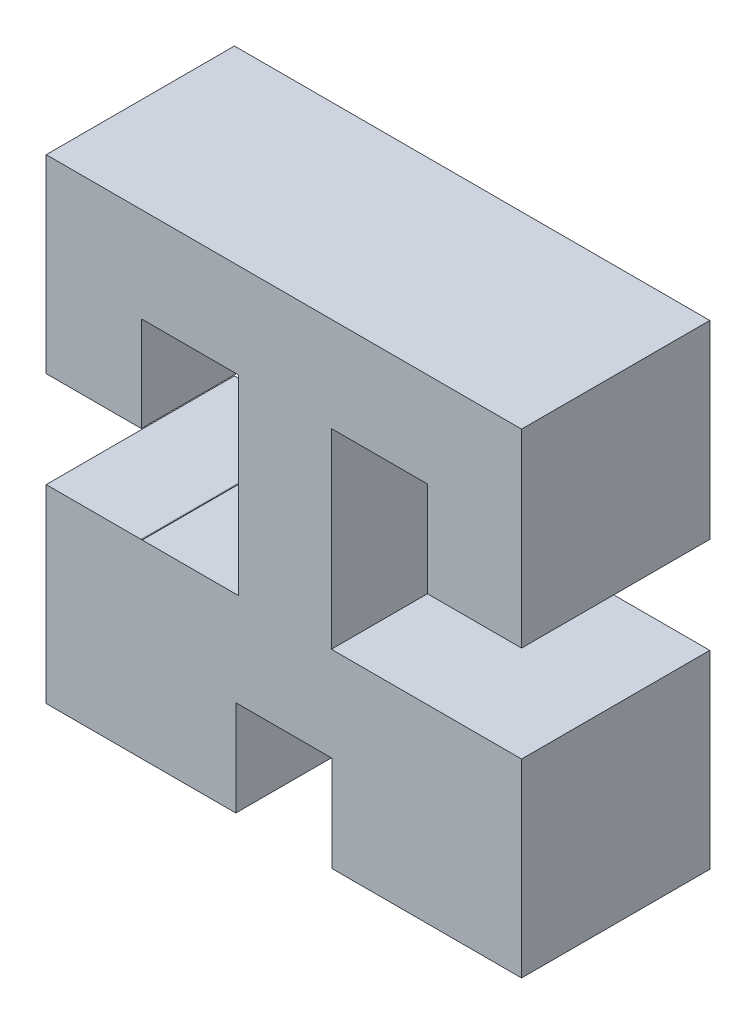
ISO-10303-21;
HEADER;
FILE_DESCRIPTION(('STEP AP214'),'2;1');
FILE_NAME('part.step','',(''),(''),'','','');
FILE_SCHEMA(('AUTOMOTIVE_DESIGN { 1 0 10303 214 1 1 1 1 }'));
ENDSEC;
DATA;
#1=APPLICATION_CONTEXT('core data for automotive mechanical design processes');
#2=APPLICATION_PROTOCOL_DEFINITION('international standard','automotive_design',2000,#1);
#3=PRODUCT_CONTEXT('',#1,'mechanical');
#4=PRODUCT('Part','Part','',(#3));
#5=PRODUCT_RELATED_PRODUCT_CATEGORY('part','',(#4));
#6=PRODUCT_DEFINITION_FORMATION('','',#4);
#7=PRODUCT_DEFINITION_CONTEXT('part definition',#1,'design');
#8=PRODUCT_DEFINITION('design','',#6,#7);
#9=PRODUCT_DEFINITION_SHAPE('','',#8);
#10=(LENGTH_UNIT() NAMED_UNIT(*) SI_UNIT(.MILLI.,.METRE.));
#11=(NAMED_UNIT(*) PLANE_ANGLE_UNIT() SI_UNIT($,.RADIAN.));
#12=(NAMED_UNIT(*) SI_UNIT($,.STERADIAN.) SOLID_ANGLE_UNIT());
#13=UNCERTAINTY_MEASURE_WITH_UNIT(LENGTH_MEASURE(1.E-05),#10,'distance_accuracy_value','');
#14=(GEOMETRIC_REPRESENTATION_CONTEXT(3) GLOBAL_UNCERTAINTY_ASSIGNED_CONTEXT((#13)) GLOBAL_UNIT_ASSIGNED_CONTEXT((#10,
#11,#12)) REPRESENTATION_CONTEXT('',''));
#15=CARTESIAN_POINT('',(0.,0.,0.));
#16=DIRECTION('',(0.,0.,1.));
#17=DIRECTION('',(1.,0.,0.));
#18=AXIS2_PLACEMENT_3D('',#15,#16,#17);
#19=CARTESIAN_POINT('',(-20.076501822496,0.,9.89999994635583));
#20=DIRECTION('',(0.,-1.,0.));
#21=DIRECTION('',(1.,0.,0.));
#22=AXIS2_PLACEMENT_3D('',#19,#20,#21);
#23=PLANE('',#22);
#24=DIRECTION('',(-1.,0.,0.));
#25=VECTOR('',#24,1.);
#26=CARTESIAN_POINT('',(-20.076501822496,0.,0.));
#27=LINE('',#26,#25);
#28=CARTESIAN_POINT('',(-20.076501822496,0.,0.));
#29=VERTEX_POINT('',#28);
#30=CARTESIAN_POINT('',(-30.050000664033,0.,0.));
#31=VERTEX_POINT('',#30);
#32=EDGE_CURVE('E254',#29,#31,#27,.T.);
#33=ORIENTED_EDGE('',*,*,#32,.F.);
#34=DIRECTION('',(0.,0.,-1.));
#35=VECTOR('',#34,1.);
#36=CARTESIAN_POINT('',(-20.076501822496,0.,9.89999994635583));
#37=LINE('',#36,#35);
#38=CARTESIAN_POINT('',(-20.076501822496,0.,9.89999994635583));
#39=VERTEX_POINT('',#38);
#40=EDGE_CURVE('E11',#39,#29,#37,.T.);
#41=ORIENTED_EDGE('',*,*,#40,.F.);
#42=DIRECTION('',(-1.,0.,0.));
#43=VECTOR('',#42,1.);
#44=CARTESIAN_POINT('',(-20.076501822496,0.,9.89999994635583));
#45=LINE('',#44,#43);
#46=CARTESIAN_POINT('',(-30.050000664033,0.,9.89999994635583));
#47=VERTEX_POINT('',#46);
#48=EDGE_CURVE('E354',#39,#47,#45,.T.);
#49=ORIENTED_EDGE('',*,*,#48,.T.);
#50=DIRECTION('',(0.,0.,-1.));
#51=VECTOR('',#50,1.);
#52=CARTESIAN_POINT('',(-30.050000664033,0.,9.89999994635583));
#53=LINE('',#52,#51);
#54=EDGE_CURVE('E46',#47,#31,#53,.T.);
#55=ORIENTED_EDGE('',*,*,#54,.T.);
#56=EDGE_LOOP('',(#33,#41,#49,#55));
#57=FACE_BOUND('',#56,.T.);
#58=ADVANCED_FACE('F43',(#57),#23,.T.);
#59=CARTESIAN_POINT('',(-20.076501822496,5.02600047940765,9.89999994635583));
#60=DIRECTION('',(1.,0.,0.));
#61=DIRECTION('',(0.,0.,-1.));
#62=AXIS2_PLACEMENT_3D('',#59,#60,#61);
#63=PLANE('',#62);
#64=DIRECTION('',(0.,-1.,0.));
#65=VECTOR('',#64,1.);
#66=CARTESIAN_POINT('',(-20.076501822496,5.02600047940765,0.));
#67=LINE('',#66,#65);
#68=CARTESIAN_POINT('',(-20.076501822496,5.02600047940765,0.));
#69=VERTEX_POINT('',#68);
#70=EDGE_CURVE('E351',#69,#29,#67,.T.);
#71=ORIENTED_EDGE('',*,*,#70,.F.);
#72=DIRECTION('',(0.,0.,-1.));
#73=VECTOR('',#72,1.);
#74=CARTESIAN_POINT('',(-20.076501822496,5.02600047940765,9.89999994635583));
#75=LINE('',#74,#73);
#76=CARTESIAN_POINT('',(-20.076501822496,5.02600047940765,9.89999994635583));
#77=VERTEX_POINT('',#76);
#78=EDGE_CURVE('E53',#77,#69,#75,.T.);
#79=ORIENTED_EDGE('',*,*,#78,.F.);
#80=DIRECTION('',(0.,-1.,0.));
#81=VECTOR('',#80,1.);
#82=CARTESIAN_POINT('',(-20.076501822496,5.02600047940765,9.89999994635583));
#83=LINE('',#82,#81);
#84=EDGE_CURVE('E240',#77,#39,#83,.T.);
#85=ORIENTED_EDGE('',*,*,#84,.T.);
#86=ORIENTED_EDGE('',*,*,#40,.T.);
#87=EDGE_LOOP('',(#71,#79,#85,#86));
#88=FACE_BOUND('',#87,.T.);
#89=ADVANCED_FACE('F427',(#88),#63,.T.);
#90=CARTESIAN_POINT('',(-15.0240010228158,5.02600047940765,9.89999994635583));
#91=DIRECTION('',(0.,-1.,0.));
#92=DIRECTION('',(0.,0.,-1.));
#93=AXIS2_PLACEMENT_3D('',#90,#91,#92);
#94=PLANE('',#93);
#95=DIRECTION('',(-1.,0.,0.));
#96=VECTOR('',#95,1.);
#97=CARTESIAN_POINT('',(-15.0240010228158,5.02600047940765,0.));
#98=LINE('',#97,#96);
#99=CARTESIAN_POINT('',(-15.0240010228158,5.02600047940765,0.));
#100=VERTEX_POINT('',#99);
#101=EDGE_CURVE('E226',#100,#69,#98,.T.);
#102=ORIENTED_EDGE('',*,*,#101,.F.);
#103=DIRECTION('',(0.,0.,-1.));
#104=VECTOR('',#103,1.);
#105=CARTESIAN_POINT('',(-15.0240010228158,5.02600047940765,9.89999994635583));
#106=LINE('',#105,#104);
#107=CARTESIAN_POINT('',(-15.0240010228158,5.02600047940765,9.89999994635583));
#108=VERTEX_POINT('',#107);
#109=EDGE_CURVE('E221',#108,#100,#106,.T.);
#110=ORIENTED_EDGE('',*,*,#109,.F.);
#111=DIRECTION('',(-1.,0.,0.));
#112=VECTOR('',#111,1.);
#113=CARTESIAN_POINT('',(-15.0240010228158,5.02600047940765,9.89999994635583));
#114=LINE('',#113,#112);
#115=EDGE_CURVE('E224',#108,#77,#114,.T.);
#116=ORIENTED_EDGE('',*,*,#115,.T.);
#117=ORIENTED_EDGE('',*,*,#78,.T.);
#118=EDGE_LOOP('',(#102,#110,#116,#117));
#119=FACE_BOUND('',#118,.T.);
#120=ADVANCED_FACE('F223',(#119),#94,.T.);
#121=CARTESIAN_POINT('',(-15.0240010228158,0.,9.89999994635583));
#122=DIRECTION('',(-1.,0.,0.));
#123=DIRECTION('',(0.,0.,1.));
#124=AXIS2_PLACEMENT_3D('',#121,#122,#123);
#125=PLANE('',#124);
#126=DIRECTION('',(0.,1.,0.));
#127=VECTOR('',#126,1.);
#128=CARTESIAN_POINT('',(-15.0240010228158,0.,0.));
#129=LINE('',#128,#127);
#130=CARTESIAN_POINT('',(-15.0240010228158,0.,0.));
#131=VERTEX_POINT('',#130);
#132=EDGE_CURVE('E346',#131,#100,#129,.T.);
#133=ORIENTED_EDGE('',*,*,#132,.F.);
#134=DIRECTION('',(0.,0.,-1.));
#135=VECTOR('',#134,1.);
#136=CARTESIAN_POINT('',(-15.0240010228158,0.,9.89999994635583));
#137=LINE('',#136,#135);
#138=CARTESIAN_POINT('',(-15.0240010228158,0.,9.89999994635583));
#139=VERTEX_POINT('',#138);
#140=EDGE_CURVE('E232',#139,#131,#137,.T.);
#141=ORIENTED_EDGE('',*,*,#140,.F.);
#142=DIRECTION('',(0.,1.,0.));
#143=VECTOR('',#142,1.);
#144=CARTESIAN_POINT('',(-15.0240010228158,0.,9.89999994635583));
#145=LINE('',#144,#143);
#146=EDGE_CURVE('E238',#139,#108,#145,.T.);
#147=ORIENTED_EDGE('',*,*,#146,.T.);
#148=ORIENTED_EDGE('',*,*,#109,.T.);
#149=EDGE_LOOP('',(#133,#141,#147,#148));
#150=FACE_BOUND('',#149,.T.);
#151=ADVANCED_FACE('F243',(#150),#125,.T.);
#152=CARTESIAN_POINT('',(-5.05000066403305,0.,9.89999994635583));
#153=DIRECTION('',(0.,-1.,0.));
#154=DIRECTION('',(0.,0.,-1.));
#155=AXIS2_PLACEMENT_3D('',#152,#153,#154);
#156=PLANE('',#155);
#157=DIRECTION('',(-1.,0.,0.));
#158=VECTOR('',#157,1.);
#159=CARTESIAN_POINT('',(-5.05000066403305,0.,0.));
#160=LINE('',#159,#158);
#161=CARTESIAN_POINT('',(-5.05000066403305,0.,0.));
#162=VERTEX_POINT('',#161);
#163=EDGE_CURVE('E342',#162,#131,#160,.T.);
#164=ORIENTED_EDGE('',*,*,#163,.F.);
#165=DIRECTION('',(0.,0.,-1.));
#166=VECTOR('',#165,1.);
#167=CARTESIAN_POINT('',(-5.05000066403305,0.,9.89999994635583));
#168=LINE('',#167,#166);
#169=CARTESIAN_POINT('',(-5.05000066403305,0.,9.89999994635583));
#170=VERTEX_POINT('',#169);
#171=EDGE_CURVE('E360',#170,#162,#168,.T.);
#172=ORIENTED_EDGE('',*,*,#171,.F.);
#173=DIRECTION('',(-1.,0.,0.));
#174=VECTOR('',#173,1.);
#175=CARTESIAN_POINT('',(-5.05000066403305,0.,9.89999994635583));
#176=LINE('',#175,#174);
#177=EDGE_CURVE('E245',#170,#139,#176,.T.);
#178=ORIENTED_EDGE('',*,*,#177,.T.);
#179=ORIENTED_EDGE('',*,*,#140,.T.);
#180=EDGE_LOOP('',(#164,#172,#178,#179));
#181=FACE_BOUND('',#180,.T.);
#182=ADVANCED_FACE('F440',(#181),#156,.T.);
#183=CARTESIAN_POINT('',(-5.05000066403305,9.97350070418237,9.89999994635583));
#184=DIRECTION('',(1.,0.,0.));
#185=DIRECTION('',(0.,0.,-1.));
#186=AXIS2_PLACEMENT_3D('',#183,#184,#185);
#187=PLANE('',#186);
#188=DIRECTION('',(0.,-1.,0.));
#189=VECTOR('',#188,1.);
#190=CARTESIAN_POINT('',(-5.05000066403305,9.97350070418237,0.));
#191=LINE('',#190,#189);
#192=CARTESIAN_POINT('',(-5.05000066403305,9.97350070418237,0.));
#193=VERTEX_POINT('',#192);
#194=EDGE_CURVE('E338',#193,#162,#191,.T.);
#195=ORIENTED_EDGE('',*,*,#194,.F.);
#196=DIRECTION('',(0.,0.,-1.));
#197=VECTOR('',#196,1.);
#198=CARTESIAN_POINT('',(-5.05000066403305,9.97350070418237,9.89999994635583));
#199=LINE('',#198,#197);
#200=CARTESIAN_POINT('',(-5.05000066403305,9.97350070418237,9.89999994635583));
#201=VERTEX_POINT('',#200);
#202=EDGE_CURVE('E363',#201,#193,#199,.T.);
#203=ORIENTED_EDGE('',*,*,#202,.F.);
#204=DIRECTION('',(0.,-1.,0.));
#205=VECTOR('',#204,1.);
#206=CARTESIAN_POINT('',(-5.05000066403305,9.97350070418237,9.89999994635583));
#207=LINE('',#206,#205);
#208=EDGE_CURVE('E248',#201,#170,#207,.T.);
#209=ORIENTED_EDGE('',*,*,#208,.T.);
#210=ORIENTED_EDGE('',*,*,#171,.T.);
#211=EDGE_LOOP('',(#195,#203,#209,#210));
#212=FACE_BOUND('',#211,.T.);
#213=ADVANCED_FACE('F443',(#212),#187,.T.);
#214=CARTESIAN_POINT('',(-10.0510007182919,9.97350070418237,9.89999994635583));
#215=DIRECTION('',(0.,1.,0.));
#216=DIRECTION('',(0.,0.,1.));
#217=AXIS2_PLACEMENT_3D('',#214,#215,#216);
#218=PLANE('',#217);
#219=DIRECTION('',(1.,0.,0.));
#220=VECTOR('',#219,1.);
#221=CARTESIAN_POINT('',(-10.0510007182919,9.97350070418237,0.));
#222=LINE('',#221,#220);
#223=CARTESIAN_POINT('',(-15.0515011179504,9.97350070418237,0.));
#224=VERTEX_POINT('',#223);
#225=EDGE_CURVE('E334',#224,#193,#222,.T.);
#226=ORIENTED_EDGE('',*,*,#225,.F.);
#227=DIRECTION('',(0.,0.,-1.));
#228=VECTOR('',#227,1.);
#229=CARTESIAN_POINT('',(-15.0515011179504,9.97350070418237,9.89999994635583));
#230=LINE('',#229,#228);
#231=CARTESIAN_POINT('',(-15.0515011179504,9.97350070418237,9.89999994635583));
#232=VERTEX_POINT('',#231);
#233=EDGE_CURVE('E366',#232,#224,#230,.T.);
#234=ORIENTED_EDGE('',*,*,#233,.F.);
#235=DIRECTION('',(1.,0.,0.));
#236=VECTOR('',#235,1.);
#237=CARTESIAN_POINT('',(-15.0515011179504,9.97350070418237,9.89999994635583));
#238=LINE('',#237,#236);
#239=EDGE_CURVE('E817',#232,#201,#238,.T.);
#240=ORIENTED_EDGE('',*,*,#239,.T.);
#241=ORIENTED_EDGE('',*,*,#202,.T.);
#242=EDGE_LOOP('',(#226,#234,#240,#241));
#243=FACE_BOUND('',#242,.T.);
#244=ADVANCED_FACE('F447',(#243),#218,.T.);
#245=CARTESIAN_POINT('',(-15.0515011179504,20.0259999206141,9.89999994635583));
#246=DIRECTION('',(1.,0.,0.));
#247=DIRECTION('',(0.,1.,0.));
#248=AXIS2_PLACEMENT_3D('',#245,#246,#247);
#249=PLANE('',#248);
#250=DIRECTION('',(0.,-1.,0.));
#251=VECTOR('',#250,1.);
#252=CARTESIAN_POINT('',(-15.0515011179504,20.0259999206141,0.));
#253=LINE('',#252,#251);
#254=CARTESIAN_POINT('',(-15.0515011179504,20.0259999206141,0.));
#255=VERTEX_POINT('',#254);
#256=EDGE_CURVE('E330',#255,#224,#253,.T.);
#257=ORIENTED_EDGE('',*,*,#256,.F.);
#258=DIRECTION('',(0.,0.,-1.));
#259=VECTOR('',#258,1.);
#260=CARTESIAN_POINT('',(-15.0515011179504,20.0259999206141,9.89999994635583));
#261=LINE('',#260,#259);
#262=CARTESIAN_POINT('',(-15.0515011179504,20.0259999206141,9.89999994635583));
#263=VERTEX_POINT('',#262);
#264=EDGE_CURVE('E370',#263,#255,#261,.T.);
#265=ORIENTED_EDGE('',*,*,#264,.F.);
#266=DIRECTION('',(0.,-1.,0.));
#267=VECTOR('',#266,1.);
#268=CARTESIAN_POINT('',(-15.0515011179504,20.0259999206141,9.89999994635583));
#269=LINE('',#268,#267);
#270=EDGE_CURVE('E815',#263,#232,#269,.T.);
#271=ORIENTED_EDGE('',*,*,#270,.T.);
#272=ORIENTED_EDGE('',*,*,#233,.T.);
#273=EDGE_LOOP('',(#257,#265,#271,#272));
#274=FACE_BOUND('',#273,.T.);
#275=ADVANCED_FACE('F451',(#274),#249,.T.);
#276=CARTESIAN_POINT('',(-9.9990003182702,20.0259999206141,9.89999994635583));
#277=DIRECTION('',(0.,-1.,0.));
#278=DIRECTION('',(0.,0.,-1.));
#279=AXIS2_PLACEMENT_3D('',#276,#277,#278);
#280=PLANE('',#279);
#281=DIRECTION('',(-1.,0.,0.));
#282=VECTOR('',#281,1.);
#283=CARTESIAN_POINT('',(-9.9990003182702,20.0259999206141,0.));
#284=LINE('',#283,#282);
#285=CARTESIAN_POINT('',(-9.9990003182702,20.0259999206141,0.));
#286=VERTEX_POINT('',#285);
#287=EDGE_CURVE('E326',#286,#255,#284,.T.);
#288=ORIENTED_EDGE('',*,*,#287,.F.);
#289=DIRECTION('',(0.,0.,-1.));
#290=VECTOR('',#289,1.);
#291=CARTESIAN_POINT('',(-9.9990003182702,20.0259999206141,9.89999994635583));
#292=LINE('',#291,#290);
#293=CARTESIAN_POINT('',(-9.9990003182702,20.0259999206141,9.89999994635583));
#294=VERTEX_POINT('',#293);
#295=EDGE_CURVE('E373',#294,#286,#292,.T.);
#296=ORIENTED_EDGE('',*,*,#295,.F.);
#297=DIRECTION('',(-1.,0.,0.));
#298=VECTOR('',#297,1.);
#299=CARTESIAN_POINT('',(-9.9990003182702,20.0259999206141,9.89999994635583));
#300=LINE('',#299,#298);
#301=EDGE_CURVE('E812',#294,#263,#300,.T.);
#302=ORIENTED_EDGE('',*,*,#301,.T.);
#303=ORIENTED_EDGE('',*,*,#264,.T.);
#304=EDGE_LOOP('',(#288,#296,#302,#303));
#305=FACE_BOUND('',#304,.T.);
#306=ADVANCED_FACE('F455',(#305),#280,.T.);
#307=CARTESIAN_POINT('',(-9.9990003182702,15.0260015038626,9.89999994635583));
#308=DIRECTION('',(-1.,0.,0.));
#309=DIRECTION('',(0.,0.,1.));
#310=AXIS2_PLACEMENT_3D('',#307,#308,#309);
#311=PLANE('',#310);
#312=DIRECTION('',(0.,1.,0.));
#313=VECTOR('',#312,1.);
#314=CARTESIAN_POINT('',(-9.9990003182702,15.0260015038626,0.));
#315=LINE('',#314,#313);
#316=CARTESIAN_POINT('',(-9.9990003182702,15.0260015038626,0.));
#317=VERTEX_POINT('',#316);
#318=EDGE_CURVE('E322',#317,#286,#315,.T.);
#319=ORIENTED_EDGE('',*,*,#318,.F.);
#320=DIRECTION('',(0.,0.,-1.));
#321=VECTOR('',#320,1.);
#322=CARTESIAN_POINT('',(-9.9990003182702,15.0260015038626,9.89999994635583));
#323=LINE('',#322,#321);
#324=CARTESIAN_POINT('',(-9.9990003182702,15.0260015038626,9.89999994635583));
#325=VERTEX_POINT('',#324);
#326=EDGE_CURVE('E376',#325,#317,#323,.T.);
#327=ORIENTED_EDGE('',*,*,#326,.F.);
#328=DIRECTION('',(0.,1.,0.));
#329=VECTOR('',#328,1.);
#330=CARTESIAN_POINT('',(-9.9990003182702,15.0260015038626,9.89999994635583));
#331=LINE('',#330,#329);
#332=EDGE_CURVE('E829',#325,#294,#331,.T.);
#333=ORIENTED_EDGE('',*,*,#332,.T.);
#334=ORIENTED_EDGE('',*,*,#295,.T.);
#335=EDGE_LOOP('',(#319,#327,#333,#334));
#336=FACE_BOUND('',#335,.T.);
#337=ADVANCED_FACE('F459',(#336),#311,.T.);
#338=CARTESIAN_POINT('',(-5.05000066403305,15.0260015038626,9.89999994635583));
#339=DIRECTION('',(0.,-1.,0.));
#340=DIRECTION('',(0.,0.,-1.));
#341=AXIS2_PLACEMENT_3D('',#338,#339,#340);
#342=PLANE('',#341);
#343=DIRECTION('',(-1.,0.,0.));
#344=VECTOR('',#343,1.);
#345=CARTESIAN_POINT('',(-5.05000066403305,15.0260015038626,0.));
#346=LINE('',#345,#344);
#347=CARTESIAN_POINT('',(-5.05000066403305,15.0260015038626,0.));
#348=VERTEX_POINT('',#347);
#349=EDGE_CURVE('E318',#348,#317,#346,.T.);
#350=ORIENTED_EDGE('',*,*,#349,.F.);
#351=DIRECTION('',(0.,0.,-1.));
#352=VECTOR('',#351,1.);
#353=CARTESIAN_POINT('',(-5.05000066403305,15.0260015038626,9.89999994635583));
#354=LINE('',#353,#352);
#355=CARTESIAN_POINT('',(-5.05000066403305,15.0260015038626,9.89999994635583));
#356=VERTEX_POINT('',#355);
#357=EDGE_CURVE('E379',#356,#348,#354,.T.);
#358=ORIENTED_EDGE('',*,*,#357,.F.);
#359=DIRECTION('',(-1.,0.,0.));
#360=VECTOR('',#359,1.);
#361=CARTESIAN_POINT('',(-5.05000066403305,15.0260015038626,9.89999994635583));
#362=LINE('',#361,#360);
#363=EDGE_CURVE('E805',#356,#325,#362,.T.);
#364=ORIENTED_EDGE('',*,*,#363,.T.);
#365=ORIENTED_EDGE('',*,*,#326,.T.);
#366=EDGE_LOOP('',(#350,#358,#364,#365));
#367=FACE_BOUND('',#366,.T.);
#368=ADVANCED_FACE('F463',(#367),#342,.T.);
#369=CARTESIAN_POINT('',(-5.05000066403305,25.0000023283066,9.89999994635583));
#370=DIRECTION('',(1.,0.,0.));
#371=DIRECTION('',(0.,0.,-1.));
#372=AXIS2_PLACEMENT_3D('',#369,#370,#371);
#373=PLANE('',#372);
#374=DIRECTION('',(0.,-1.,0.));
#375=VECTOR('',#374,1.);
#376=CARTESIAN_POINT('',(-5.05000066403305,25.0000023283066,0.));
#377=LINE('',#376,#375);
#378=CARTESIAN_POINT('',(-5.05000066403305,25.0000023283066,0.));
#379=VERTEX_POINT('',#378);
#380=EDGE_CURVE('E314',#379,#348,#377,.T.);
#381=ORIENTED_EDGE('',*,*,#380,.F.);
#382=DIRECTION('',(0.,0.,-1.));
#383=VECTOR('',#382,1.);
#384=CARTESIAN_POINT('',(-5.05000066403305,25.0000023283066,9.89999994635583));
#385=LINE('',#384,#383);
#386=CARTESIAN_POINT('',(-5.05000066403305,25.0000023283066,9.89999994635583));
#387=VERTEX_POINT('',#386);
#388=EDGE_CURVE('E382',#387,#379,#385,.T.);
#389=ORIENTED_EDGE('',*,*,#388,.F.);
#390=DIRECTION('',(0.,-1.,0.));
#391=VECTOR('',#390,1.);
#392=CARTESIAN_POINT('',(-5.05000066403305,25.0000023283066,9.89999994635583));
#393=LINE('',#392,#391);
#394=EDGE_CURVE('E801',#387,#356,#393,.T.);
#395=ORIENTED_EDGE('',*,*,#394,.T.);
#396=ORIENTED_EDGE('',*,*,#357,.T.);
#397=EDGE_LOOP('',(#381,#389,#395,#396));
#398=FACE_BOUND('',#397,.T.);
#399=ADVANCED_FACE('F467',(#398),#373,.T.);
#400=CARTESIAN_POINT('',(-30.050000664033,25.0000023283066,9.89999994635583));
#401=DIRECTION('',(0.,1.,0.));
#402=DIRECTION('',(0.,0.,1.));
#403=AXIS2_PLACEMENT_3D('',#400,#401,#402);
#404=PLANE('',#403);
#405=DIRECTION('',(1.,0.,0.));
#406=VECTOR('',#405,1.);
#407=CARTESIAN_POINT('',(-30.050000664033,25.0000023283066,0.));
#408=LINE('',#407,#406);
#409=CARTESIAN_POINT('',(-30.050000664033,25.0000023283066,0.));
#410=VERTEX_POINT('',#409);
#411=EDGE_CURVE('E310',#410,#379,#408,.T.);
#412=ORIENTED_EDGE('',*,*,#411,.F.);
#413=DIRECTION('',(0.,0.,-1.));
#414=VECTOR('',#413,1.);
#415=CARTESIAN_POINT('',(-30.050000664033,25.0000023283066,9.89999994635583));
#416=LINE('',#415,#414);
#417=CARTESIAN_POINT('',(-30.050000664033,25.0000023283066,9.89999994635583));
#418=VERTEX_POINT('',#417);
#419=EDGE_CURVE('E385',#418,#410,#416,.T.);
#420=ORIENTED_EDGE('',*,*,#419,.F.);
#421=DIRECTION('',(1.,0.,0.));
#422=VECTOR('',#421,1.);
#423=CARTESIAN_POINT('',(-30.050000664033,25.0000023283066,9.89999994635583));
#424=LINE('',#423,#422);
#425=EDGE_CURVE('E836',#418,#387,#424,.T.);
#426=ORIENTED_EDGE('',*,*,#425,.T.);
#427=ORIENTED_EDGE('',*,*,#388,.T.);
#428=EDGE_LOOP('',(#412,#420,#426,#427));
#429=FACE_BOUND('',#428,.T.);
#430=ADVANCED_FACE('F471',(#429),#404,.T.);
#431=CARTESIAN_POINT('',(-30.050000664033,15.0260015038626,9.89999994635583));
#432=DIRECTION('',(-1.,0.,0.));
#433=DIRECTION('',(0.,0.,1.));
#434=AXIS2_PLACEMENT_3D('',#431,#432,#433);
#435=PLANE('',#434);
#436=DIRECTION('',(0.,1.,0.));
#437=VECTOR('',#436,1.);
#438=CARTESIAN_POINT('',(-30.050000664033,15.0260015038626,0.));
#439=LINE('',#438,#437);
#440=CARTESIAN_POINT('',(-30.050000664033,15.0260015038626,0.));
#441=VERTEX_POINT('',#440);
#442=EDGE_CURVE('E306',#441,#410,#439,.T.);
#443=ORIENTED_EDGE('',*,*,#442,.F.);
#444=DIRECTION('',(0.,0.,-1.));
#445=VECTOR('',#444,1.);
#446=CARTESIAN_POINT('',(-30.050000664033,15.0260015038626,9.89999994635583));
#447=LINE('',#446,#445);
#448=CARTESIAN_POINT('',(-30.050000664033,15.0260015038626,9.89999994635583));
#449=VERTEX_POINT('',#448);
#450=EDGE_CURVE('E388',#449,#441,#447,.T.);
#451=ORIENTED_EDGE('',*,*,#450,.F.);
#452=DIRECTION('',(0.,1.,0.));
#453=VECTOR('',#452,1.);
#454=CARTESIAN_POINT('',(-30.050000664033,15.0260015038626,9.89999994635583));
#455=LINE('',#454,#453);
#456=EDGE_CURVE('E794',#449,#418,#455,.T.);
#457=ORIENTED_EDGE('',*,*,#456,.T.);
#458=ORIENTED_EDGE('',*,*,#419,.T.);
#459=EDGE_LOOP('',(#443,#451,#457,#458));
#460=FACE_BOUND('',#459,.T.);
#461=ADVANCED_FACE('F475',(#460),#435,.T.);
#462=CARTESIAN_POINT('',(-25.0500013159589,15.0260015038626,9.89999994635583));
#463=DIRECTION('',(0.,-1.,0.));
#464=DIRECTION('',(0.,0.,-1.));
#465=AXIS2_PLACEMENT_3D('',#462,#463,#464);
#466=PLANE('',#465);
#467=DIRECTION('',(-1.,0.,0.));
#468=VECTOR('',#467,1.);
#469=CARTESIAN_POINT('',(-25.0500013159589,15.0260015038626,0.));
#470=LINE('',#469,#468);
#471=CARTESIAN_POINT('',(-25.0500013159589,15.0260015038626,0.));
#472=VERTEX_POINT('',#471);
#473=EDGE_CURVE('E302',#472,#441,#470,.T.);
#474=ORIENTED_EDGE('',*,*,#473,.F.);
#475=DIRECTION('',(0.,0.,-1.));
#476=VECTOR('',#475,1.);
#477=CARTESIAN_POINT('',(-25.0500013159589,15.0260015038626,9.89999994635583));
#478=LINE('',#477,#476);
#479=CARTESIAN_POINT('',(-25.0500013159589,15.0260015038626,9.89999994635583));
#480=VERTEX_POINT('',#479);
#481=EDGE_CURVE('E391',#480,#472,#478,.T.);
#482=ORIENTED_EDGE('',*,*,#481,.F.);
#483=DIRECTION('',(-1.,0.,0.));
#484=VECTOR('',#483,1.);
#485=CARTESIAN_POINT('',(-25.0500013159589,15.0260015038626,9.89999994635583));
#486=LINE('',#485,#484);
#487=EDGE_CURVE('E790',#480,#449,#486,.T.);
#488=ORIENTED_EDGE('',*,*,#487,.T.);
#489=ORIENTED_EDGE('',*,*,#450,.T.);
#490=EDGE_LOOP('',(#474,#482,#488,#489));
#491=FACE_BOUND('',#490,.T.);
#492=ADVANCED_FACE('F479',(#491),#466,.T.);
#493=CARTESIAN_POINT('',(-25.0500013159589,20.0000011175872,9.89999994635583));
#494=DIRECTION('',(1.,0.,0.));
#495=DIRECTION('',(0.,0.,-1.));
#496=AXIS2_PLACEMENT_3D('',#493,#494,#495);
#497=PLANE('',#496);
#498=DIRECTION('',(0.,-1.,0.));
#499=VECTOR('',#498,1.);
#500=CARTESIAN_POINT('',(-25.0500013159589,20.0000011175872,0.));
#501=LINE('',#500,#499);
#502=CARTESIAN_POINT('',(-25.0500013159589,20.0000011175872,0.));
#503=VERTEX_POINT('',#502);
#504=EDGE_CURVE('E298',#503,#472,#501,.T.);
#505=ORIENTED_EDGE('',*,*,#504,.F.);
#506=DIRECTION('',(0.,0.,-1.));
#507=VECTOR('',#506,1.);
#508=CARTESIAN_POINT('',(-25.0500013159589,20.0000011175872,9.89999994635583));
#509=LINE('',#508,#507);
#510=CARTESIAN_POINT('',(-25.0500013159589,20.0000011175872,9.89999994635583));
#511=VERTEX_POINT('',#510);
#512=EDGE_CURVE('E394',#511,#503,#509,.T.);
#513=ORIENTED_EDGE('',*,*,#512,.F.);
#514=DIRECTION('',(0.,-1.,0.));
#515=VECTOR('',#514,1.);
#516=CARTESIAN_POINT('',(-25.0500013159589,20.0000011175872,9.89999994635583));
#517=LINE('',#516,#515);
#518=EDGE_CURVE('E843',#511,#480,#517,.T.);
#519=ORIENTED_EDGE('',*,*,#518,.T.);
#520=ORIENTED_EDGE('',*,*,#481,.T.);
#521=EDGE_LOOP('',(#505,#513,#519,#520));
#522=FACE_BOUND('',#521,.T.);
#523=ADVANCED_FACE('F483',(#522),#497,.T.);
#524=CARTESIAN_POINT('',(-25.0010007061847,20.0000011175872,9.89999994635583));
#525=DIRECTION('',(0.,-1.,0.));
#526=DIRECTION('',(0.,0.,-1.));
#527=AXIS2_PLACEMENT_3D('',#524,#525,#526);
#528=PLANE('',#527);
#529=DIRECTION('',(-1.,0.,0.));
#530=VECTOR('',#529,1.);
#531=CARTESIAN_POINT('',(-25.0010007061847,20.0000011175872,0.));
#532=LINE('',#531,#530);
#533=CARTESIAN_POINT('',(-25.0010007061847,20.0000011175872,0.));
#534=VERTEX_POINT('',#533);
#535=EDGE_CURVE('E294',#534,#503,#532,.T.);
#536=ORIENTED_EDGE('',*,*,#535,.F.);
#537=DIRECTION('',(0.,0.,-1.));
#538=VECTOR('',#537,1.);
#539=CARTESIAN_POINT('',(-25.0010007061847,20.0000011175872,9.89999994635583));
#540=LINE('',#539,#538);
#541=CARTESIAN_POINT('',(-25.0010007061847,20.0000011175872,9.89999994635583));
#542=VERTEX_POINT('',#541);
#543=EDGE_CURVE('E397',#542,#534,#540,.T.);
#544=ORIENTED_EDGE('',*,*,#543,.F.);
#545=DIRECTION('',(-1.,0.,0.));
#546=VECTOR('',#545,1.);
#547=CARTESIAN_POINT('',(-25.0010007061847,20.0000011175872,9.89999994635583));
#548=LINE('',#547,#546);
#549=EDGE_CURVE('E783',#542,#511,#548,.T.);
#550=ORIENTED_EDGE('',*,*,#549,.T.);
#551=ORIENTED_EDGE('',*,*,#512,.T.);
#552=EDGE_LOOP('',(#536,#544,#550,#551));
#553=FACE_BOUND('',#552,.T.);
#554=ADVANCED_FACE('F487',(#553),#528,.T.);
#555=CARTESIAN_POINT('',(-25.0010007061847,20.0259999206141,9.89999994635583));
#556=DIRECTION('',(1.,0.,0.));
#557=DIRECTION('',(0.,0.,-1.));
#558=AXIS2_PLACEMENT_3D('',#555,#556,#557);
#559=PLANE('',#558);
#560=DIRECTION('',(0.,-1.,0.));
#561=VECTOR('',#560,1.);
#562=CARTESIAN_POINT('',(-25.0010007061847,20.0259999206141,0.));
#563=LINE('',#562,#561);
#564=CARTESIAN_POINT('',(-25.0010007061847,20.0259999206141,0.));
#565=VERTEX_POINT('',#564);
#566=EDGE_CURVE('E290',#565,#534,#563,.T.);
#567=ORIENTED_EDGE('',*,*,#566,.F.);
#568=DIRECTION('',(0.,0.,-1.));
#569=VECTOR('',#568,1.);
#570=CARTESIAN_POINT('',(-25.0010007061847,20.0259999206141,9.89999994635583));
#571=LINE('',#570,#569);
#572=CARTESIAN_POINT('',(-25.0010007061847,20.0259999206141,9.89999994635583));
#573=VERTEX_POINT('',#572);
#574=EDGE_CURVE('E400',#573,#565,#571,.T.);
#575=ORIENTED_EDGE('',*,*,#574,.F.);
#576=DIRECTION('',(0.,-1.,0.));
#577=VECTOR('',#576,1.);
#578=CARTESIAN_POINT('',(-25.0010007061847,20.0259999206141,9.89999994635583));
#579=LINE('',#578,#577);
#580=EDGE_CURVE('E779',#573,#542,#579,.T.);
#581=ORIENTED_EDGE('',*,*,#580,.T.);
#582=ORIENTED_EDGE('',*,*,#543,.T.);
#583=EDGE_LOOP('',(#567,#575,#581,#582));
#584=FACE_BOUND('',#583,.T.);
#585=ADVANCED_FACE('F491',(#584),#559,.T.);
#586=CARTESIAN_POINT('',(-19.9490018894115,20.0259999206141,9.89999994635583));
#587=DIRECTION('',(0.,-1.,0.));
#588=DIRECTION('',(0.,0.,-1.));
#589=AXIS2_PLACEMENT_3D('',#586,#587,#588);
#590=PLANE('',#589);
#591=DIRECTION('',(-1.,0.,0.));
#592=VECTOR('',#591,1.);
#593=CARTESIAN_POINT('',(-19.9490018894115,20.0259999206141,0.));
#594=LINE('',#593,#592);
#595=CARTESIAN_POINT('',(-19.9490018894115,20.0259999206141,0.));
#596=VERTEX_POINT('',#595);
#597=EDGE_CURVE('E286',#596,#565,#594,.T.);
#598=ORIENTED_EDGE('',*,*,#597,.F.);
#599=DIRECTION('',(0.,0.,-1.));
#600=VECTOR('',#599,1.);
#601=CARTESIAN_POINT('',(-19.9490018894115,20.0259999206141,9.89999994635583));
#602=LINE('',#601,#600);
#603=CARTESIAN_POINT('',(-19.9490018894115,20.0259999206141,9.89999994635583));
#604=VERTEX_POINT('',#603);
#605=EDGE_CURVE('E403',#604,#596,#602,.T.);
#606=ORIENTED_EDGE('',*,*,#605,.F.);
#607=DIRECTION('',(-1.,0.,0.));
#608=VECTOR('',#607,1.);
#609=CARTESIAN_POINT('',(-19.9490018894115,20.0259999206141,9.89999994635583));
#610=LINE('',#609,#608);
#611=EDGE_CURVE('E850',#604,#573,#610,.T.);
#612=ORIENTED_EDGE('',*,*,#611,.T.);
#613=ORIENTED_EDGE('',*,*,#574,.T.);
#614=EDGE_LOOP('',(#598,#606,#612,#613));
#615=FACE_BOUND('',#614,.T.);
#616=ADVANCED_FACE('F495',(#615),#590,.T.);
#617=CARTESIAN_POINT('',(-19.9490018894115,9.97400082444406,9.89999994635583));
#618=DIRECTION('',(-1.,0.,0.));
#619=DIRECTION('',(0.,0.,1.));
#620=AXIS2_PLACEMENT_3D('',#617,#618,#619);
#621=PLANE('',#620);
#622=DIRECTION('',(0.,1.,0.));
#623=VECTOR('',#622,1.);
#624=CARTESIAN_POINT('',(-19.9490018894115,9.97400082444406,0.));
#625=LINE('',#624,#623);
#626=CARTESIAN_POINT('',(-19.9490018894115,9.97400082444406,0.));
#627=VERTEX_POINT('',#626);
#628=EDGE_CURVE('E282',#627,#596,#625,.T.);
#629=ORIENTED_EDGE('',*,*,#628,.F.);
#630=DIRECTION('',(0.,0.,-1.));
#631=VECTOR('',#630,1.);
#632=CARTESIAN_POINT('',(-19.9490018894115,9.97400082444406,9.89999994635583));
#633=LINE('',#632,#631);
#634=CARTESIAN_POINT('',(-19.9490018894115,9.97400082444406,9.89999994635583));
#635=VERTEX_POINT('',#634);
#636=EDGE_CURVE('E406',#635,#627,#633,.T.);
#637=ORIENTED_EDGE('',*,*,#636,.F.);
#638=DIRECTION('',(0.,1.,0.));
#639=VECTOR('',#638,1.);
#640=CARTESIAN_POINT('',(-19.9490018894115,9.97400082444406,9.89999994635583));
#641=LINE('',#640,#639);
#642=EDGE_CURVE('E772',#635,#604,#641,.T.);
#643=ORIENTED_EDGE('',*,*,#642,.T.);
#644=ORIENTED_EDGE('',*,*,#605,.T.);
#645=EDGE_LOOP('',(#629,#637,#643,#644));
#646=FACE_BOUND('',#645,.T.);
#647=ADVANCED_FACE('F499',(#646),#621,.T.);
#648=CARTESIAN_POINT('',(-25.0010007061847,9.97400082444406,9.89999994635583));
#649=DIRECTION('',(0.,1.,0.));
#650=DIRECTION('',(0.,0.,1.));
#651=AXIS2_PLACEMENT_3D('',#648,#649,#650);
#652=PLANE('',#651);
#653=DIRECTION('',(1.,0.,0.));
#654=VECTOR('',#653,1.);
#655=CARTESIAN_POINT('',(-25.0010007061847,9.97400082444406,0.));
#656=LINE('',#655,#654);
#657=CARTESIAN_POINT('',(-25.0010007061847,9.97400082444406,0.));
#658=VERTEX_POINT('',#657);
#659=EDGE_CURVE('E278',#658,#627,#656,.T.);
#660=ORIENTED_EDGE('',*,*,#659,.F.);
#661=DIRECTION('',(0.,0.,-1.));
#662=VECTOR('',#661,1.);
#663=CARTESIAN_POINT('',(-25.0010007061847,9.97400082444406,9.89999994635583));
#664=LINE('',#663,#662);
#665=CARTESIAN_POINT('',(-25.0010007061847,9.97400082444406,9.89999994635583));
#666=VERTEX_POINT('',#665);
#667=EDGE_CURVE('E409',#666,#658,#664,.T.);
#668=ORIENTED_EDGE('',*,*,#667,.F.);
#669=DIRECTION('',(1.,0.,0.));
#670=VECTOR('',#669,1.);
#671=CARTESIAN_POINT('',(-25.0010007061847,9.97400082444406,9.89999994635583));
#672=LINE('',#671,#670);
#673=EDGE_CURVE('E768',#666,#635,#672,.T.);
#674=ORIENTED_EDGE('',*,*,#673,.T.);
#675=ORIENTED_EDGE('',*,*,#636,.T.);
#676=EDGE_LOOP('',(#660,#668,#674,#675));
#677=FACE_BOUND('',#676,.T.);
#678=ADVANCED_FACE('F503',(#677),#652,.T.);
#679=CARTESIAN_POINT('',(-25.0010007061847,10.0000005587936,9.89999994635583));
#680=DIRECTION('',(1.,0.,0.));
#681=DIRECTION('',(0.,0.,-1.));
#682=AXIS2_PLACEMENT_3D('',#679,#680,#681);
#683=PLANE('',#682);
#684=DIRECTION('',(0.,-1.,0.));
#685=VECTOR('',#684,1.);
#686=CARTESIAN_POINT('',(-25.0010007061847,10.0000005587936,0.));
#687=LINE('',#686,#685);
#688=CARTESIAN_POINT('',(-25.0010007061847,10.0000005587936,0.));
#689=VERTEX_POINT('',#688);
#690=EDGE_CURVE('E274',#689,#658,#687,.T.);
#691=ORIENTED_EDGE('',*,*,#690,.F.);
#692=DIRECTION('',(0.,0.,-1.));
#693=VECTOR('',#692,1.);
#694=CARTESIAN_POINT('',(-25.0010007061847,10.0000005587936,9.89999994635583));
#695=LINE('',#694,#693);
#696=CARTESIAN_POINT('',(-25.0010007061847,10.0000005587936,9.89999994635583));
#697=VERTEX_POINT('',#696);
#698=EDGE_CURVE('E412',#697,#689,#695,.T.);
#699=ORIENTED_EDGE('',*,*,#698,.F.);
#700=DIRECTION('',(0.,-1.,0.));
#701=VECTOR('',#700,1.);
#702=CARTESIAN_POINT('',(-25.0010007061847,10.0000005587936,9.89999994635583));
#703=LINE('',#702,#701);
#704=EDGE_CURVE('E857',#697,#666,#703,.T.);
#705=ORIENTED_EDGE('',*,*,#704,.T.);
#706=ORIENTED_EDGE('',*,*,#667,.T.);
#707=EDGE_LOOP('',(#691,#699,#705,#706));
#708=FACE_BOUND('',#707,.T.);
#709=ADVANCED_FACE('F507',(#708),#683,.T.);
#710=CARTESIAN_POINT('',(-25.0490010754355,10.0000005587936,9.89999994635583));
#711=DIRECTION('',(0.,1.,0.));
#712=DIRECTION('',(0.,0.,1.));
#713=AXIS2_PLACEMENT_3D('',#710,#711,#712);
#714=PLANE('',#713);
#715=DIRECTION('',(1.,0.,0.));
#716=VECTOR('',#715,1.);
#717=CARTESIAN_POINT('',(-25.0490010754355,10.0000005587936,0.));
#718=LINE('',#717,#716);
#719=CARTESIAN_POINT('',(-25.0490010754355,10.0000005587936,0.));
#720=VERTEX_POINT('',#719);
#721=EDGE_CURVE('E270',#720,#689,#718,.T.);
#722=ORIENTED_EDGE('',*,*,#721,.F.);
#723=DIRECTION('',(0.,0.,-1.));
#724=VECTOR('',#723,1.);
#725=CARTESIAN_POINT('',(-25.0490010754355,10.0000005587936,9.89999994635583));
#726=LINE('',#725,#724);
#727=CARTESIAN_POINT('',(-25.0490010754355,10.0000005587936,9.89999994635583));
#728=VERTEX_POINT('',#727);
#729=EDGE_CURVE('E415',#728,#720,#726,.T.);
#730=ORIENTED_EDGE('',*,*,#729,.F.);
#731=DIRECTION('',(1.,0.,0.));
#732=VECTOR('',#731,1.);
#733=CARTESIAN_POINT('',(-25.0490010754355,10.0000005587936,9.89999994635583));
#734=LINE('',#733,#732);
#735=EDGE_CURVE('E761',#728,#697,#734,.T.);
#736=ORIENTED_EDGE('',*,*,#735,.T.);
#737=ORIENTED_EDGE('',*,*,#698,.T.);
#738=EDGE_LOOP('',(#722,#730,#736,#737));
#739=FACE_BOUND('',#738,.T.);
#740=ADVANCED_FACE('F511',(#739),#714,.T.);
#741=CARTESIAN_POINT('',(-25.0490010754355,9.97350070418237,9.89999994635583));
#742=DIRECTION('',(-1.,0.,0.));
#743=DIRECTION('',(0.,0.,1.));
#744=AXIS2_PLACEMENT_3D('',#741,#742,#743);
#745=PLANE('',#744);
#746=DIRECTION('',(0.,1.,0.));
#747=VECTOR('',#746,1.);
#748=CARTESIAN_POINT('',(-25.0490010754355,9.97350070418237,0.));
#749=LINE('',#748,#747);
#750=CARTESIAN_POINT('',(-25.0490010754355,9.97350070418237,0.));
#751=VERTEX_POINT('',#750);
#752=EDGE_CURVE('E266',#751,#720,#749,.T.);
#753=ORIENTED_EDGE('',*,*,#752,.F.);
#754=DIRECTION('',(0.,0.,-1.));
#755=VECTOR('',#754,1.);
#756=CARTESIAN_POINT('',(-25.0490010754355,9.97350070418237,9.89999994635583));
#757=LINE('',#756,#755);
#758=CARTESIAN_POINT('',(-25.0490010754355,9.97350070418237,9.89999994635583));
#759=VERTEX_POINT('',#758);
#760=EDGE_CURVE('E418',#759,#751,#757,.T.);
#761=ORIENTED_EDGE('',*,*,#760,.F.);
#762=DIRECTION('',(0.,1.,0.));
#763=VECTOR('',#762,1.);
#764=CARTESIAN_POINT('',(-25.0490010754355,9.97350070418237,9.89999994635583));
#765=LINE('',#764,#763);
#766=EDGE_CURVE('E757',#759,#728,#765,.T.);
#767=ORIENTED_EDGE('',*,*,#766,.T.);
#768=ORIENTED_EDGE('',*,*,#729,.T.);
#769=EDGE_LOOP('',(#753,#761,#767,#768));
#770=FACE_BOUND('',#769,.T.);
#771=ADVANCED_FACE('F515',(#770),#745,.T.);
#772=CARTESIAN_POINT('',(-30.050000664033,9.97350070418237,9.89999994635583));
#773=DIRECTION('',(0.,1.,0.));
#774=DIRECTION('',(0.,0.,1.));
#775=AXIS2_PLACEMENT_3D('',#772,#773,#774);
#776=PLANE('',#775);
#777=DIRECTION('',(1.,0.,0.));
#778=VECTOR('',#777,1.);
#779=CARTESIAN_POINT('',(-30.050000664033,9.97350070418237,0.));
#780=LINE('',#779,#778);
#781=CARTESIAN_POINT('',(-30.050000664033,9.97350070418237,0.));
#782=VERTEX_POINT('',#781);
#783=EDGE_CURVE('E262',#782,#751,#780,.T.);
#784=ORIENTED_EDGE('',*,*,#783,.F.);
#785=DIRECTION('',(0.,0.,-1.));
#786=VECTOR('',#785,1.);
#787=CARTESIAN_POINT('',(-30.050000664033,9.97350070418237,9.89999994635583));
#788=LINE('',#787,#786);
#789=CARTESIAN_POINT('',(-30.050000664033,9.97350070418237,9.89999994635583));
#790=VERTEX_POINT('',#789);
#791=EDGE_CURVE('E420',#790,#782,#788,.T.);
#792=ORIENTED_EDGE('',*,*,#791,.F.);
#793=DIRECTION('',(1.,0.,0.));
#794=VECTOR('',#793,1.);
#795=CARTESIAN_POINT('',(-30.050000664033,9.97350070418237,9.89999994635583));
#796=LINE('',#795,#794);
#797=EDGE_CURVE('E864',#790,#759,#796,.T.);
#798=ORIENTED_EDGE('',*,*,#797,.T.);
#799=ORIENTED_EDGE('',*,*,#760,.T.);
#800=EDGE_LOOP('',(#784,#792,#798,#799));
#801=FACE_BOUND('',#800,.T.);
#802=ADVANCED_FACE('F519',(#801),#776,.T.);
#803=CARTESIAN_POINT('',(-30.050000664033,0.,9.89999994635583));
#804=DIRECTION('',(-1.,0.,0.));
#805=DIRECTION('',(0.,0.,1.));
#806=AXIS2_PLACEMENT_3D('',#803,#804,#805);
#807=PLANE('',#806);
#808=DIRECTION('',(0.,1.,0.));
#809=VECTOR('',#808,1.);
#810=CARTESIAN_POINT('',(-30.050000664033,0.,0.));
#811=LINE('',#810,#809);
#812=EDGE_CURVE('E258',#31,#782,#811,.T.);
#813=ORIENTED_EDGE('',*,*,#812,.F.);
#814=ORIENTED_EDGE('',*,*,#54,.F.);
#815=DIRECTION('',(0.,1.,0.));
#816=VECTOR('',#815,1.);
#817=CARTESIAN_POINT('',(-30.050000664033,0.,9.89999994635583));
#818=LINE('',#817,#816);
#819=EDGE_CURVE('E867',#47,#790,#818,.T.);
#820=ORIENTED_EDGE('',*,*,#819,.T.);
#821=ORIENTED_EDGE('',*,*,#791,.T.);
#822=EDGE_LOOP('',(#813,#814,#820,#821));
#823=FACE_BOUND('',#822,.T.);
#824=ADVANCED_FACE('F424',(#823),#807,.T.);
#825=CARTESIAN_POINT('',(0.,0.,9.89999994635583));
#826=DIRECTION('',(0.,0.,-1.));
#827=DIRECTION('',(-1.,0.,0.));
#828=AXIS2_PLACEMENT_3D('',#825,#826,#827);
#829=PLANE('',#828);
#830=ORIENTED_EDGE('',*,*,#48,.F.);
#831=ORIENTED_EDGE('',*,*,#84,.F.);
#832=ORIENTED_EDGE('',*,*,#115,.F.);
#833=ORIENTED_EDGE('',*,*,#146,.F.);
#834=ORIENTED_EDGE('',*,*,#177,.F.);
#835=ORIENTED_EDGE('',*,*,#208,.F.);
#836=ORIENTED_EDGE('',*,*,#239,.F.);
#837=ORIENTED_EDGE('',*,*,#270,.F.);
#838=ORIENTED_EDGE('',*,*,#301,.F.);
#839=ORIENTED_EDGE('',*,*,#332,.F.);
#840=ORIENTED_EDGE('',*,*,#363,.F.);
#841=ORIENTED_EDGE('',*,*,#394,.F.);
#842=ORIENTED_EDGE('',*,*,#425,.F.);
#843=ORIENTED_EDGE('',*,*,#456,.F.);
#844=ORIENTED_EDGE('',*,*,#487,.F.);
#845=ORIENTED_EDGE('',*,*,#518,.F.);
#846=ORIENTED_EDGE('',*,*,#549,.F.);
#847=ORIENTED_EDGE('',*,*,#580,.F.);
#848=ORIENTED_EDGE('',*,*,#611,.F.);
#849=ORIENTED_EDGE('',*,*,#642,.F.);
#850=ORIENTED_EDGE('',*,*,#673,.F.);
#851=ORIENTED_EDGE('',*,*,#704,.F.);
#852=ORIENTED_EDGE('',*,*,#735,.F.);
#853=ORIENTED_EDGE('',*,*,#766,.F.);
#854=ORIENTED_EDGE('',*,*,#797,.F.);
#855=ORIENTED_EDGE('',*,*,#819,.F.);
#856=EDGE_LOOP('',(#830,#831,#832,#833,#834,#835,#836,#837,#838,#839,#840,#841,#842,#843,#844,
#845,#846,#847,#848,#849,#850,#851,#852,#853,#854,#855));
#857=FACE_BOUND('',#856,.T.);
#858=ADVANCED_FACE('F236',(#857),#829,.F.);
#859=CARTESIAN_POINT('',(0.,0.,0.));
#860=DIRECTION('',(0.,0.,-1.));
#861=DIRECTION('',(-1.,0.,0.));
#862=AXIS2_PLACEMENT_3D('',#859,#860,#861);
#863=PLANE('',#862);
#864=ORIENTED_EDGE('',*,*,#32,.T.);
#865=ORIENTED_EDGE('',*,*,#812,.T.);
#866=ORIENTED_EDGE('',*,*,#783,.T.);
#867=ORIENTED_EDGE('',*,*,#752,.T.);
#868=ORIENTED_EDGE('',*,*,#721,.T.);
#869=ORIENTED_EDGE('',*,*,#690,.T.);
#870=ORIENTED_EDGE('',*,*,#659,.T.);
#871=ORIENTED_EDGE('',*,*,#628,.T.);
#872=ORIENTED_EDGE('',*,*,#597,.T.);
#873=ORIENTED_EDGE('',*,*,#566,.T.);
#874=ORIENTED_EDGE('',*,*,#535,.T.);
#875=ORIENTED_EDGE('',*,*,#504,.T.);
#876=ORIENTED_EDGE('',*,*,#473,.T.);
#877=ORIENTED_EDGE('',*,*,#442,.T.);
#878=ORIENTED_EDGE('',*,*,#411,.T.);
#879=ORIENTED_EDGE('',*,*,#380,.T.);
#880=ORIENTED_EDGE('',*,*,#349,.T.);
#881=ORIENTED_EDGE('',*,*,#318,.T.);
#882=ORIENTED_EDGE('',*,*,#287,.T.);
#883=ORIENTED_EDGE('',*,*,#256,.T.);
#884=ORIENTED_EDGE('',*,*,#225,.T.);
#885=ORIENTED_EDGE('',*,*,#194,.T.);
#886=ORIENTED_EDGE('',*,*,#163,.T.);
#887=ORIENTED_EDGE('',*,*,#132,.T.);
#888=ORIENTED_EDGE('',*,*,#101,.T.);
#889=ORIENTED_EDGE('',*,*,#70,.T.);
#890=EDGE_LOOP('',(#864,#865,#866,#867,#868,#869,#870,#871,#872,#873,#874,#875,#876,#877,#878,
#879,#880,#881,#882,#883,#884,#885,#886,#887,#888,#889));
#891=FACE_BOUND('',#890,.T.);
#892=ADVANCED_FACE('F426',(#891),#863,.T.);
#893=CLOSED_SHELL('',(#58,#89,#120,#151,#182,#213,#244,#275,#306,#337,#368,#399,#430,#461,#492,
#523,#554,#585,#616,#647,#678,#709,#740,#771,#802,#824,#858,#892));
#894=MANIFOLD_SOLID_BREP('B2',#893);
#895=ADVANCED_BREP_SHAPE_REPRESENTATION('',(#18,#894),#14);
#896=SHAPE_DEFINITION_REPRESENTATION(#9,#895);
ENDSEC;
END-ISO-10303-21;
